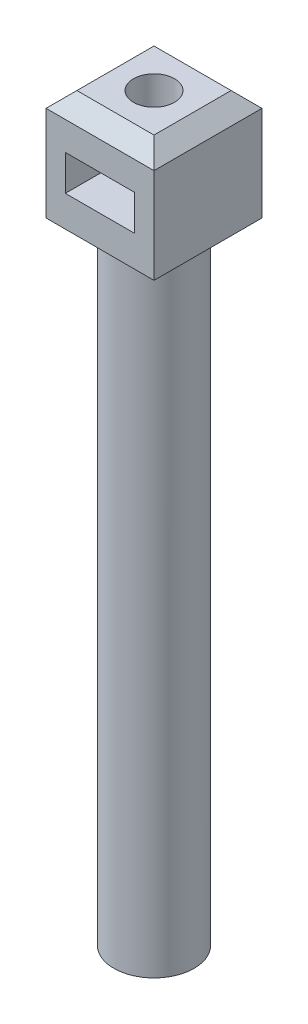
ISO-10303-21;
HEADER;
FILE_DESCRIPTION(('STEP AP214'),'2;1');
FILE_NAME('part.step','',(''),(''),'','','');
FILE_SCHEMA(('AUTOMOTIVE_DESIGN { 1 0 10303 214 1 1 1 1 }'));
ENDSEC;
DATA;
#1=APPLICATION_CONTEXT('core data for automotive mechanical design processes');
#2=APPLICATION_PROTOCOL_DEFINITION('international standard','automotive_design',2000,#1);
#3=PRODUCT_CONTEXT('',#1,'mechanical');
#4=PRODUCT('Part','Part','',(#3));
#5=PRODUCT_RELATED_PRODUCT_CATEGORY('part','',(#4));
#6=PRODUCT_DEFINITION_FORMATION('','',#4);
#7=PRODUCT_DEFINITION_CONTEXT('part definition',#1,'design');
#8=PRODUCT_DEFINITION('design','',#6,#7);
#9=PRODUCT_DEFINITION_SHAPE('','',#8);
#10=(LENGTH_UNIT() NAMED_UNIT(*) SI_UNIT(.MILLI.,.METRE.));
#11=(NAMED_UNIT(*) PLANE_ANGLE_UNIT() SI_UNIT($,.RADIAN.));
#12=(NAMED_UNIT(*) SI_UNIT($,.STERADIAN.) SOLID_ANGLE_UNIT());
#13=UNCERTAINTY_MEASURE_WITH_UNIT(LENGTH_MEASURE(1.E-05),#10,'distance_accuracy_value','');
#14=(GEOMETRIC_REPRESENTATION_CONTEXT(3) GLOBAL_UNCERTAINTY_ASSIGNED_CONTEXT((#13)) GLOBAL_UNIT_ASSIGNED_CONTEXT((#10,
#11,#12)) REPRESENTATION_CONTEXT('',''));
#15=CARTESIAN_POINT('',(0.,0.,0.));
#16=DIRECTION('',(0.,0.,1.));
#17=DIRECTION('',(1.,0.,0.));
#18=AXIS2_PLACEMENT_3D('',#15,#16,#17);
#19=CARTESIAN_POINT('',(0.,50.8,0.));
#20=DIRECTION('',(0.,-1.,0.));
#21=DIRECTION('',(0.,0.,-1.));
#22=AXIS2_PLACEMENT_3D('',#19,#20,#21);
#23=PLANE('',#22);
#24=DIRECTION('',(0.,0.,-1.));
#25=VECTOR('',#24,1.);
#26=CARTESIAN_POINT('',(-6.34999999999998,50.8,-8.89));
#27=LINE('',#26,#25);
#28=CARTESIAN_POINT('',(-6.34999999999998,50.8,-1.81392282084995));
#29=VERTEX_POINT('',#28);
#30=CARTESIAN_POINT('',(-6.34999999999998,50.8,-6.34999999999998));
#31=VERTEX_POINT('',#30);
#32=EDGE_CURVE('E194',#29,#31,#27,.T.);
#33=ORIENTED_EDGE('',*,*,#32,.T.);
#34=DIRECTION('',(1.,0.,0.));
#35=VECTOR('',#34,1.);
#36=CARTESIAN_POINT('',(8.89,50.8,-6.34999999999998));
#37=LINE('',#36,#35);
#38=CARTESIAN_POINT('',(-1.81392282084994,50.8,-6.34999999999998));
#39=VERTEX_POINT('',#38);
#40=EDGE_CURVE('E196',#31,#39,#37,.T.);
#41=ORIENTED_EDGE('',*,*,#40,.T.);
#42=CARTESIAN_POINT('',(0.,50.8,0.));
#43=DIRECTION('',(0.,-1.,0.));
#44=DIRECTION('',(0.,0.,-1.));
#45=AXIS2_PLACEMENT_3D('',#42,#43,#44);
#46=CIRCLE('',#45,6.604);
#47=EDGE_CURVE('E287',#29,#39,#46,.T.);
#48=ORIENTED_EDGE('',*,*,#47,.F.);
#49=EDGE_LOOP('',(#33,#41,#48));
#50=FACE_BOUND('',#49,.T.);
#51=ADVANCED_FACE('F35',(#50),#23,.T.);
#52=CARTESIAN_POINT('',(1.81392282084994,50.8,-6.34999999999998));
#53=VERTEX_POINT('',#52);
#54=CARTESIAN_POINT('',(6.34999999999999,50.8,-1.81392282084993));
#55=VERTEX_POINT('',#54);
#56=EDGE_CURVE('E159',#53,#55,#46,.T.);
#57=ORIENTED_EDGE('',*,*,#56,.F.);
#58=DIRECTION('',(1.,0.,0.));
#59=VECTOR('',#58,1.);
#60=CARTESIAN_POINT('',(8.89,50.8,-6.34999999999998));
#61=LINE('',#60,#59);
#62=CARTESIAN_POINT('',(6.34999999999999,50.8,-6.34999999999998));
#63=VERTEX_POINT('',#62);
#64=EDGE_CURVE('E192',#53,#63,#61,.T.);
#65=ORIENTED_EDGE('',*,*,#64,.T.);
#66=DIRECTION('',(0.,0.,1.));
#67=VECTOR('',#66,1.);
#68=CARTESIAN_POINT('',(6.34999999999999,50.8,8.89));
#69=LINE('',#68,#67);
#70=EDGE_CURVE('E190',#63,#55,#69,.T.);
#71=ORIENTED_EDGE('',*,*,#70,.T.);
#72=EDGE_LOOP('',(#57,#65,#71));
#73=FACE_BOUND('',#72,.T.);
#74=ADVANCED_FACE('F318',(#73),#23,.T.);
#75=CARTESIAN_POINT('',(6.34999999999999,50.8,1.81392282084993));
#76=VERTEX_POINT('',#75);
#77=CARTESIAN_POINT('',(1.81392282084994,50.8,6.34999999999998));
#78=VERTEX_POINT('',#77);
#79=EDGE_CURVE('E289',#76,#78,#46,.T.);
#80=ORIENTED_EDGE('',*,*,#79,.F.);
#81=DIRECTION('',(0.,0.,1.));
#82=VECTOR('',#81,1.);
#83=CARTESIAN_POINT('',(6.34999999999999,50.8,8.89));
#84=LINE('',#83,#82);
#85=CARTESIAN_POINT('',(6.34999999999999,50.8,6.34999999999998));
#86=VERTEX_POINT('',#85);
#87=EDGE_CURVE('E188',#76,#86,#84,.T.);
#88=ORIENTED_EDGE('',*,*,#87,.T.);
#89=DIRECTION('',(-1.,0.,0.));
#90=VECTOR('',#89,1.);
#91=CARTESIAN_POINT('',(-8.89,50.8,6.34999999999998));
#92=LINE('',#91,#90);
#93=EDGE_CURVE('E186',#86,#78,#92,.T.);
#94=ORIENTED_EDGE('',*,*,#93,.T.);
#95=EDGE_LOOP('',(#80,#88,#94));
#96=FACE_BOUND('',#95,.T.);
#97=ADVANCED_FACE('F339',(#96),#23,.T.);
#98=CARTESIAN_POINT('',(0.,63.5,0.));
#99=DIRECTION('',(0.,-1.,0.));
#100=DIRECTION('',(0.,0.,-1.));
#101=AXIS2_PLACEMENT_3D('',#98,#99,#100);
#102=CYLINDRICAL_SURFACE('',#101,6.604);
#103=ORIENTED_EDGE('',*,*,#56,.T.);
#104=CARTESIAN_POINT('',(0.,45.4717173420242,0.));
#105=DIRECTION('',(0.642787609686544,-0.766044443118974,0.));
#106=DIRECTION('',(-0.766044443118974,-0.642787609686544,0.));
#107=AXIS2_PLACEMENT_3D('',#104,#105,#106);
#108=ELLIPSE('',#107,8.62090973875041,6.604);
#109=EDGE_CURVE('E212',#55,#76,#108,.T.);
#110=ORIENTED_EDGE('',*,*,#109,.T.);
#111=ORIENTED_EDGE('',*,*,#79,.T.);
#112=CARTESIAN_POINT('',(0.,45.4717173420242,0.));
#113=DIRECTION('',(0.,-0.766044443118974,0.642787609686544));
#114=DIRECTION('',(0.,-0.642787609686544,-0.766044443118974));
#115=AXIS2_PLACEMENT_3D('',#112,#113,#114);
#116=ELLIPSE('',#115,8.62090973875041,6.604);
#117=CARTESIAN_POINT('',(-1.81392282084994,50.8,6.34999999999998));
#118=VERTEX_POINT('',#117);
#119=EDGE_CURVE('E214',#78,#118,#116,.T.);
#120=ORIENTED_EDGE('',*,*,#119,.T.);
#121=CARTESIAN_POINT('',(-6.34999999999998,50.8,1.81392282084995));
#122=VERTEX_POINT('',#121);
#123=EDGE_CURVE('E294',#118,#122,#46,.T.);
#124=ORIENTED_EDGE('',*,*,#123,.T.);
#125=CARTESIAN_POINT('',(0.,45.4717173420242,0.));
#126=DIRECTION('',(-0.642787609686544,-0.766044443118974,0.));
#127=DIRECTION('',(0.766044443118974,-0.642787609686544,0.));
#128=AXIS2_PLACEMENT_3D('',#125,#126,#127);
#129=ELLIPSE('',#128,8.62090973875041,6.604);
#130=EDGE_CURVE('E210',#122,#29,#129,.T.);
#131=ORIENTED_EDGE('',*,*,#130,.T.);
#132=ORIENTED_EDGE('',*,*,#47,.T.);
#133=CARTESIAN_POINT('',(0.,45.4717173420242,0.));
#134=DIRECTION('',(0.,-0.766044443118974,-0.642787609686544));
#135=DIRECTION('',(0.,-0.642787609686544,0.766044443118974));
#136=AXIS2_PLACEMENT_3D('',#133,#134,#135);
#137=ELLIPSE('',#136,8.62090973875041,6.604);
#138=EDGE_CURVE('E208',#39,#53,#137,.T.);
#139=ORIENTED_EDGE('',*,*,#138,.T.);
#140=EDGE_LOOP('',(#103,#110,#111,#120,#124,#131,#132,#139));
#141=FACE_BOUND('',#140,.T.);
#142=CARTESIAN_POINT('',(0.,-50.8,0.));
#143=DIRECTION('',(0.,-1.,0.));
#144=DIRECTION('',(0.,0.,-1.));
#145=AXIS2_PLACEMENT_3D('',#142,#143,#144);
#146=CIRCLE('',#145,6.604);
#147=CARTESIAN_POINT('',(0.,-50.8,-6.604));
#148=VERTEX_POINT('',#147);
#149=EDGE_CURVE('E249',#148,#148,#146,.T.);
#150=ORIENTED_EDGE('',*,*,#149,.F.);
#151=EDGE_LOOP('',(#150));
#152=FACE_BOUND('',#151,.T.);
#153=ADVANCED_FACE('F300',(#141,#152),#102,.T.);
#154=DIRECTION('',(-1.,0.,0.));
#155=VECTOR('',#154,1.);
#156=CARTESIAN_POINT('',(-8.89,50.8,6.34999999999998));
#157=LINE('',#156,#155);
#158=CARTESIAN_POINT('',(-6.34999999999998,50.8,6.34999999999998));
#159=VERTEX_POINT('',#158);
#160=EDGE_CURVE('E182',#118,#159,#157,.T.);
#161=ORIENTED_EDGE('',*,*,#160,.T.);
#162=DIRECTION('',(0.,0.,-1.));
#163=VECTOR('',#162,1.);
#164=CARTESIAN_POINT('',(-6.34999999999998,50.8,-8.89));
#165=LINE('',#164,#163);
#166=EDGE_CURVE('E184',#159,#122,#165,.T.);
#167=ORIENTED_EDGE('',*,*,#166,.T.);
#168=ORIENTED_EDGE('',*,*,#123,.F.);
#169=EDGE_LOOP('',(#161,#167,#168));
#170=FACE_BOUND('',#169,.T.);
#171=ADVANCED_FACE('F342',(#170),#23,.T.);
#172=CARTESIAN_POINT('',(8.89,71.12,8.89));
#173=DIRECTION('',(-1.,0.,0.));
#174=DIRECTION('',(0.,0.,1.));
#175=AXIS2_PLACEMENT_3D('',#172,#173,#174);
#176=PLANE('',#175);
#177=DIRECTION('',(0.,-1.,0.));
#178=VECTOR('',#177,1.);
#179=CARTESIAN_POINT('',(8.89,71.12,-8.89));
#180=LINE('',#179,#178);
#181=CARTESIAN_POINT('',(8.89,68.58,-8.89));
#182=VERTEX_POINT('',#181);
#183=CARTESIAN_POINT('',(8.89,52.9313130631903,-8.89));
#184=VERTEX_POINT('',#183);
#185=EDGE_CURVE('E286',#182,#184,#180,.T.);
#186=ORIENTED_EDGE('',*,*,#185,.F.);
#187=DIRECTION('',(0.,0.,1.));
#188=VECTOR('',#187,1.);
#189=CARTESIAN_POINT('',(8.89,68.58,8.89));
#190=LINE('',#189,#188);
#191=CARTESIAN_POINT('',(8.89,68.58,8.89));
#192=VERTEX_POINT('',#191);
#193=EDGE_CURVE('E232',#182,#192,#190,.T.);
#194=ORIENTED_EDGE('',*,*,#193,.T.);
#195=DIRECTION('',(0.,-1.,0.));
#196=VECTOR('',#195,1.);
#197=CARTESIAN_POINT('',(8.89,71.12,8.89));
#198=LINE('',#197,#196);
#199=CARTESIAN_POINT('',(8.89,52.9313130631903,8.89));
#200=VERTEX_POINT('',#199);
#201=EDGE_CURVE('E280',#192,#200,#198,.T.);
#202=ORIENTED_EDGE('',*,*,#201,.T.);
#203=DIRECTION('',(0.,0.,-1.));
#204=VECTOR('',#203,1.);
#205=CARTESIAN_POINT('',(8.89,52.9313130631903,-8.89));
#206=LINE('',#205,#204);
#207=EDGE_CURVE('E202',#200,#184,#206,.T.);
#208=ORIENTED_EDGE('',*,*,#207,.T.);
#209=EDGE_LOOP('',(#186,#194,#202,#208));
#210=FACE_BOUND('',#209,.T.);
#211=ADVANCED_FACE('F330',(#210),#176,.F.);
#212=CARTESIAN_POINT('',(-8.89,71.12,-8.89));
#213=DIRECTION('',(0.,0.,1.));
#214=DIRECTION('',(1.,0.,0.));
#215=AXIS2_PLACEMENT_3D('',#212,#213,#214);
#216=PLANE('',#215);
#217=DIRECTION('',(1.,0.,0.));
#218=VECTOR('',#217,1.);
#219=CARTESIAN_POINT('',(-8.89,58.039,-8.89));
#220=LINE('',#219,#218);
#221=CARTESIAN_POINT('',(-5.71500000000003,58.039,-8.89));
#222=VERTEX_POINT('',#221);
#223=CARTESIAN_POINT('',(5.71499999999997,58.039,-8.89));
#224=VERTEX_POINT('',#223);
#225=EDGE_CURVE('E274',#222,#224,#220,.T.);
#226=ORIENTED_EDGE('',*,*,#225,.T.);
#227=DIRECTION('',(0.,1.,0.));
#228=VECTOR('',#227,1.);
#229=CARTESIAN_POINT('',(5.71499999999997,71.12,-8.89));
#230=LINE('',#229,#228);
#231=CARTESIAN_POINT('',(5.71499999999997,63.881,-8.89));
#232=VERTEX_POINT('',#231);
#233=EDGE_CURVE('E277',#224,#232,#230,.T.);
#234=ORIENTED_EDGE('',*,*,#233,.T.);
#235=DIRECTION('',(-1.,0.,0.));
#236=VECTOR('',#235,1.);
#237=CARTESIAN_POINT('',(-8.89,63.881,-8.89));
#238=LINE('',#237,#236);
#239=CARTESIAN_POINT('',(-5.71500000000003,63.881,-8.89));
#240=VERTEX_POINT('',#239);
#241=EDGE_CURVE('E269',#232,#240,#238,.T.);
#242=ORIENTED_EDGE('',*,*,#241,.T.);
#243=DIRECTION('',(0.,-1.,0.));
#244=VECTOR('',#243,1.);
#245=CARTESIAN_POINT('',(-5.71500000000003,71.12,-8.89));
#246=LINE('',#245,#244);
#247=EDGE_CURVE('E166',#240,#222,#246,.T.);
#248=ORIENTED_EDGE('',*,*,#247,.T.);
#249=EDGE_LOOP('',(#226,#234,#242,#248));
#250=FACE_BOUND('',#249,.T.);
#251=DIRECTION('',(0.,-1.,0.));
#252=VECTOR('',#251,1.);
#253=CARTESIAN_POINT('',(-8.89,71.12,-8.89));
#254=LINE('',#253,#252);
#255=CARTESIAN_POINT('',(-8.89,68.58,-8.89));
#256=VERTEX_POINT('',#255);
#257=CARTESIAN_POINT('',(-8.89,52.9313130631903,-8.89));
#258=VERTEX_POINT('',#257);
#259=EDGE_CURVE('E284',#256,#258,#254,.T.);
#260=ORIENTED_EDGE('',*,*,#259,.F.);
#261=DIRECTION('',(1.,0.,0.));
#262=VECTOR('',#261,1.);
#263=CARTESIAN_POINT('',(-8.89,68.58,-8.89));
#264=LINE('',#263,#262);
#265=EDGE_CURVE('E242',#256,#182,#264,.T.);
#266=ORIENTED_EDGE('',*,*,#265,.T.);
#267=ORIENTED_EDGE('',*,*,#185,.T.);
#268=DIRECTION('',(-1.,0.,0.));
#269=VECTOR('',#268,1.);
#270=CARTESIAN_POINT('',(-8.89,52.9313130631903,-8.89));
#271=LINE('',#270,#269);
#272=EDGE_CURVE('E179',#184,#258,#271,.T.);
#273=ORIENTED_EDGE('',*,*,#272,.T.);
#274=EDGE_LOOP('',(#260,#266,#267,#273));
#275=FACE_BOUND('',#274,.T.);
#276=ADVANCED_FACE('F326',(#250,#275),#216,.F.);
#277=CARTESIAN_POINT('',(-8.89,71.12,8.89));
#278=DIRECTION('',(1.,0.,0.));
#279=DIRECTION('',(0.,0.,-1.));
#280=AXIS2_PLACEMENT_3D('',#277,#278,#279);
#281=PLANE('',#280);
#282=DIRECTION('',(0.,-1.,0.));
#283=VECTOR('',#282,1.);
#284=CARTESIAN_POINT('',(-8.89,71.12,8.89));
#285=LINE('',#284,#283);
#286=CARTESIAN_POINT('',(-8.89,68.58,8.89));
#287=VERTEX_POINT('',#286);
#288=CARTESIAN_POINT('',(-8.89,52.9313130631903,8.89));
#289=VERTEX_POINT('',#288);
#290=EDGE_CURVE('E282',#287,#289,#285,.T.);
#291=ORIENTED_EDGE('',*,*,#290,.F.);
#292=DIRECTION('',(0.,0.,-1.));
#293=VECTOR('',#292,1.);
#294=CARTESIAN_POINT('',(-8.89,68.58,8.89));
#295=LINE('',#294,#293);
#296=EDGE_CURVE('E44',#287,#256,#295,.T.);
#297=ORIENTED_EDGE('',*,*,#296,.T.);
#298=ORIENTED_EDGE('',*,*,#259,.T.);
#299=DIRECTION('',(0.,0.,1.));
#300=VECTOR('',#299,1.);
#301=CARTESIAN_POINT('',(-8.89,52.9313130631903,8.89));
#302=LINE('',#301,#300);
#303=EDGE_CURVE('E199',#258,#289,#302,.T.);
#304=ORIENTED_EDGE('',*,*,#303,.T.);
#305=EDGE_LOOP('',(#291,#297,#298,#304));
#306=FACE_BOUND('',#305,.T.);
#307=ADVANCED_FACE('F443',(#306),#281,.F.);
#308=CARTESIAN_POINT('',(-8.89,71.12,8.89));
#309=DIRECTION('',(0.,0.,-1.));
#310=DIRECTION('',(-1.,0.,0.));
#311=AXIS2_PLACEMENT_3D('',#308,#309,#310);
#312=PLANE('',#311);
#313=DIRECTION('',(1.,0.,0.));
#314=VECTOR('',#313,1.);
#315=CARTESIAN_POINT('',(-8.89,63.881,8.89));
#316=LINE('',#315,#314);
#317=CARTESIAN_POINT('',(-5.71500000000003,63.881,8.89));
#318=VERTEX_POINT('',#317);
#319=CARTESIAN_POINT('',(5.71499999999997,63.881,8.89));
#320=VERTEX_POINT('',#319);
#321=EDGE_CURVE('E147',#318,#320,#316,.T.);
#322=ORIENTED_EDGE('',*,*,#321,.T.);
#323=DIRECTION('',(0.,-1.,0.));
#324=VECTOR('',#323,1.);
#325=CARTESIAN_POINT('',(5.71499999999997,71.12,8.89));
#326=LINE('',#325,#324);
#327=CARTESIAN_POINT('',(5.71499999999997,58.039,8.89));
#328=VERTEX_POINT('',#327);
#329=EDGE_CURVE('E174',#320,#328,#326,.T.);
#330=ORIENTED_EDGE('',*,*,#329,.T.);
#331=DIRECTION('',(-1.,0.,0.));
#332=VECTOR('',#331,1.);
#333=CARTESIAN_POINT('',(-8.89,58.039,8.89));
#334=LINE('',#333,#332);
#335=CARTESIAN_POINT('',(-5.71500000000003,58.039,8.89));
#336=VERTEX_POINT('',#335);
#337=EDGE_CURVE('E172',#328,#336,#334,.T.);
#338=ORIENTED_EDGE('',*,*,#337,.T.);
#339=DIRECTION('',(0.,1.,0.));
#340=VECTOR('',#339,1.);
#341=CARTESIAN_POINT('',(-5.71500000000003,71.12,8.89));
#342=LINE('',#341,#340);
#343=EDGE_CURVE('E158',#336,#318,#342,.T.);
#344=ORIENTED_EDGE('',*,*,#343,.T.);
#345=EDGE_LOOP('',(#322,#330,#338,#344));
#346=FACE_BOUND('',#345,.T.);
#347=ORIENTED_EDGE('',*,*,#201,.F.);
#348=DIRECTION('',(-1.,0.,0.));
#349=VECTOR('',#348,1.);
#350=CARTESIAN_POINT('',(-8.89,68.58,8.89));
#351=LINE('',#350,#349);
#352=EDGE_CURVE('E11',#192,#287,#351,.T.);
#353=ORIENTED_EDGE('',*,*,#352,.T.);
#354=ORIENTED_EDGE('',*,*,#290,.T.);
#355=DIRECTION('',(1.,0.,0.));
#356=VECTOR('',#355,1.);
#357=CARTESIAN_POINT('',(8.89,52.9313130631903,8.89));
#358=LINE('',#357,#356);
#359=EDGE_CURVE('E205',#289,#200,#358,.T.);
#360=ORIENTED_EDGE('',*,*,#359,.T.);
#361=EDGE_LOOP('',(#347,#353,#354,#360));
#362=FACE_BOUND('',#361,.T.);
#363=ADVANCED_FACE('F171',(#346,#362),#312,.F.);
#364=CARTESIAN_POINT('',(0.,71.12,0.));
#365=DIRECTION('',(0.,-1.,0.));
#366=DIRECTION('',(0.,0.,-1.));
#367=AXIS2_PLACEMENT_3D('',#364,#365,#366);
#368=PLANE('',#367);
#369=CARTESIAN_POINT('',(0.,71.12,0.));
#370=DIRECTION('',(0.,1.,0.));
#371=DIRECTION('',(0.,0.,1.));
#372=AXIS2_PLACEMENT_3D('',#369,#370,#371);
#373=CIRCLE('',#372,3.37819999999999);
#374=CARTESIAN_POINT('',(0.,71.12,3.37819999999999));
#375=VERTEX_POINT('',#374);
#376=EDGE_CURVE('E256',#375,#375,#373,.T.);
#377=ORIENTED_EDGE('',*,*,#376,.F.);
#378=EDGE_LOOP('',(#377));
#379=FACE_BOUND('',#378,.T.);
#380=DIRECTION('',(0.,0.,-1.));
#381=VECTOR('',#380,1.);
#382=CARTESIAN_POINT('',(6.35,71.12,0.));
#383=LINE('',#382,#381);
#384=CARTESIAN_POINT('',(6.35,71.12,6.35));
#385=VERTEX_POINT('',#384);
#386=CARTESIAN_POINT('',(6.35,71.12,-6.35));
#387=VERTEX_POINT('',#386);
#388=EDGE_CURVE('E216',#385,#387,#383,.T.);
#389=ORIENTED_EDGE('',*,*,#388,.T.);
#390=DIRECTION('',(-1.,0.,0.));
#391=VECTOR('',#390,1.);
#392=CARTESIAN_POINT('',(0.,71.12,-6.35));
#393=LINE('',#392,#391);
#394=CARTESIAN_POINT('',(-6.35,71.12,-6.35));
#395=VERTEX_POINT('',#394);
#396=EDGE_CURVE('E239',#387,#395,#393,.T.);
#397=ORIENTED_EDGE('',*,*,#396,.T.);
#398=DIRECTION('',(0.,0.,1.));
#399=VECTOR('',#398,1.);
#400=CARTESIAN_POINT('',(-6.35,71.12,0.));
#401=LINE('',#400,#399);
#402=CARTESIAN_POINT('',(-6.35,71.12,6.35));
#403=VERTEX_POINT('',#402);
#404=EDGE_CURVE('E237',#395,#403,#401,.T.);
#405=ORIENTED_EDGE('',*,*,#404,.T.);
#406=DIRECTION('',(1.,0.,0.));
#407=VECTOR('',#406,1.);
#408=CARTESIAN_POINT('',(0.,71.12,6.35));
#409=LINE('',#408,#407);
#410=EDGE_CURVE('E235',#403,#385,#409,.T.);
#411=ORIENTED_EDGE('',*,*,#410,.T.);
#412=EDGE_LOOP('',(#389,#397,#405,#411));
#413=FACE_BOUND('',#412,.T.);
#414=ADVANCED_FACE('F461',(#379,#413),#368,.F.);
#415=CARTESIAN_POINT('',(5.71499999999997,58.039,-12.7));
#416=DIRECTION('',(1.,0.,0.));
#417=DIRECTION('',(0.,0.,-1.));
#418=AXIS2_PLACEMENT_3D('',#415,#416,#417);
#419=PLANE('',#418);
#420=DIRECTION('',(0.,0.,1.));
#421=VECTOR('',#420,1.);
#422=CARTESIAN_POINT('',(5.71499999999997,58.039,-12.7));
#423=LINE('',#422,#421);
#424=EDGE_CURVE('E266',#224,#328,#423,.T.);
#425=ORIENTED_EDGE('',*,*,#424,.T.);
#426=ORIENTED_EDGE('',*,*,#329,.F.);
#427=DIRECTION('',(0.,0.,1.));
#428=VECTOR('',#427,1.);
#429=CARTESIAN_POINT('',(5.71499999999997,63.881,-12.7));
#430=LINE('',#429,#428);
#431=EDGE_CURVE('E153',#232,#320,#430,.T.);
#432=ORIENTED_EDGE('',*,*,#431,.F.);
#433=ORIENTED_EDGE('',*,*,#233,.F.);
#434=EDGE_LOOP('',(#425,#426,#432,#433));
#435=FACE_BOUND('',#434,.T.);
#436=ADVANCED_FACE('F469',(#435),#419,.F.);
#437=CARTESIAN_POINT('',(-5.71500000000003,58.039,-12.7));
#438=DIRECTION('',(0.,-1.,0.));
#439=DIRECTION('',(0.,0.,-1.));
#440=AXIS2_PLACEMENT_3D('',#437,#438,#439);
#441=PLANE('',#440);
#442=DIRECTION('',(0.,0.,1.));
#443=VECTOR('',#442,1.);
#444=CARTESIAN_POINT('',(-5.71500000000003,58.039,-12.7));
#445=LINE('',#444,#443);
#446=EDGE_CURVE('E168',#222,#336,#445,.T.);
#447=ORIENTED_EDGE('',*,*,#446,.T.);
#448=ORIENTED_EDGE('',*,*,#337,.F.);
#449=ORIENTED_EDGE('',*,*,#424,.F.);
#450=ORIENTED_EDGE('',*,*,#225,.F.);
#451=EDGE_LOOP('',(#447,#448,#449,#450));
#452=FACE_BOUND('',#451,.T.);
#453=ADVANCED_FACE('F524',(#452),#441,.F.);
#454=CARTESIAN_POINT('',(-5.71500000000003,58.039,-12.7));
#455=DIRECTION('',(-1.,0.,0.));
#456=DIRECTION('',(0.,0.,1.));
#457=AXIS2_PLACEMENT_3D('',#454,#455,#456);
#458=PLANE('',#457);
#459=DIRECTION('',(0.,0.,1.));
#460=VECTOR('',#459,1.);
#461=CARTESIAN_POINT('',(-5.71500000000003,63.881,-12.7));
#462=LINE('',#461,#460);
#463=EDGE_CURVE('E150',#240,#318,#462,.T.);
#464=ORIENTED_EDGE('',*,*,#463,.T.);
#465=ORIENTED_EDGE('',*,*,#343,.F.);
#466=ORIENTED_EDGE('',*,*,#446,.F.);
#467=ORIENTED_EDGE('',*,*,#247,.F.);
#468=EDGE_LOOP('',(#464,#465,#466,#467));
#469=FACE_BOUND('',#468,.T.);
#470=ADVANCED_FACE('F162',(#469),#458,.F.);
#471=CARTESIAN_POINT('',(-5.71500000000003,63.881,-12.7));
#472=DIRECTION('',(0.,1.,0.));
#473=DIRECTION('',(0.,0.,1.));
#474=AXIS2_PLACEMENT_3D('',#471,#472,#473);
#475=PLANE('',#474);
#476=CARTESIAN_POINT('',(0.,63.881,0.));
#477=DIRECTION('',(0.,1.,0.));
#478=DIRECTION('',(0.,0.,1.));
#479=AXIS2_PLACEMENT_3D('',#476,#477,#478);
#480=CIRCLE('',#479,3.3782);
#481=CARTESIAN_POINT('',(0.,63.881,3.3782));
#482=VERTEX_POINT('',#481);
#483=EDGE_CURVE('E221',#482,#482,#480,.T.);
#484=ORIENTED_EDGE('',*,*,#483,.T.);
#485=EDGE_LOOP('',(#484));
#486=FACE_BOUND('',#485,.T.);
#487=ORIENTED_EDGE('',*,*,#431,.T.);
#488=ORIENTED_EDGE('',*,*,#321,.F.);
#489=ORIENTED_EDGE('',*,*,#463,.F.);
#490=ORIENTED_EDGE('',*,*,#241,.F.);
#491=EDGE_LOOP('',(#487,#488,#489,#490));
#492=FACE_BOUND('',#491,.T.);
#493=ADVANCED_FACE('F149',(#486,#492),#475,.F.);
#494=CARTESIAN_POINT('',(-8.89,52.9313130631903,8.89));
#495=DIRECTION('',(0.,-0.766044443118974,0.642787609686544));
#496=DIRECTION('',(-1.,0.,0.));
#497=AXIS2_PLACEMENT_3D('',#494,#495,#496);
#498=PLANE('',#497);
#499=ORIENTED_EDGE('',*,*,#119,.F.);
#500=ORIENTED_EDGE('',*,*,#93,.F.);
#501=DIRECTION('',(0.608120402411341,0.510273605374742,0.608120402411341));
#502=VECTOR('',#501,1.);
#503=CARTESIAN_POINT('',(2.31477066432161,47.4140405527165,2.3147706643216));
#504=LINE('',#503,#502);
#505=EDGE_CURVE('E227',#200,#86,#504,.F.);
#506=ORIENTED_EDGE('',*,*,#505,.F.);
#507=ORIENTED_EDGE('',*,*,#359,.F.);
#508=DIRECTION('',(0.608120402411341,-0.510273605374742,-0.608120402411341));
#509=VECTOR('',#508,1.);
#510=CARTESIAN_POINT('',(-8.89,52.9313130631903,8.89));
#511=LINE('',#510,#509);
#512=EDGE_CURVE('E224',#159,#289,#511,.F.);
#513=ORIENTED_EDGE('',*,*,#512,.F.);
#514=ORIENTED_EDGE('',*,*,#160,.F.);
#515=EDGE_LOOP('',(#499,#500,#506,#507,#513,#514));
#516=FACE_BOUND('',#515,.T.);
#517=ADVANCED_FACE('F335',(#516),#498,.T.);
#518=CARTESIAN_POINT('',(8.89,52.9313130631903,8.89));
#519=DIRECTION('',(0.642787609686544,-0.766044443118974,0.));
#520=DIRECTION('',(0.,0.,1.));
#521=AXIS2_PLACEMENT_3D('',#518,#519,#520);
#522=PLANE('',#521);
#523=ORIENTED_EDGE('',*,*,#109,.F.);
#524=ORIENTED_EDGE('',*,*,#70,.F.);
#525=DIRECTION('',(0.608120402411341,0.510273605374742,-0.608120402411341));
#526=VECTOR('',#525,1.);
#527=CARTESIAN_POINT('',(2.3147706643216,47.4140405527165,-2.3147706643216));
#528=LINE('',#527,#526);
#529=EDGE_CURVE('E220',#184,#63,#528,.F.);
#530=ORIENTED_EDGE('',*,*,#529,.F.);
#531=ORIENTED_EDGE('',*,*,#207,.F.);
#532=ORIENTED_EDGE('',*,*,#505,.T.);
#533=ORIENTED_EDGE('',*,*,#87,.F.);
#534=EDGE_LOOP('',(#523,#524,#530,#531,#532,#533));
#535=FACE_BOUND('',#534,.T.);
#536=ADVANCED_FACE('F322',(#535),#522,.T.);
#537=CARTESIAN_POINT('',(-8.89,52.9313130631903,8.89));
#538=DIRECTION('',(-0.642787609686544,-0.766044443118974,0.));
#539=DIRECTION('',(0.,0.,-1.));
#540=AXIS2_PLACEMENT_3D('',#537,#538,#539);
#541=PLANE('',#540);
#542=ORIENTED_EDGE('',*,*,#512,.T.);
#543=ORIENTED_EDGE('',*,*,#303,.F.);
#544=DIRECTION('',(0.608120402411341,-0.510273605374742,0.608120402411341));
#545=VECTOR('',#544,1.);
#546=CARTESIAN_POINT('',(-2.3147706643216,47.4140405527165,-2.3147706643216));
#547=LINE('',#546,#545);
#548=EDGE_CURVE('E217',#31,#258,#547,.F.);
#549=ORIENTED_EDGE('',*,*,#548,.F.);
#550=ORIENTED_EDGE('',*,*,#32,.F.);
#551=ORIENTED_EDGE('',*,*,#130,.F.);
#552=ORIENTED_EDGE('',*,*,#166,.F.);
#553=EDGE_LOOP('',(#542,#543,#549,#550,#551,#552));
#554=FACE_BOUND('',#553,.T.);
#555=ADVANCED_FACE('F308',(#554),#541,.T.);
#556=CARTESIAN_POINT('',(-8.89,52.9313130631903,-8.89));
#557=DIRECTION('',(0.,-0.766044443118974,-0.642787609686544));
#558=DIRECTION('',(1.,0.,0.));
#559=AXIS2_PLACEMENT_3D('',#556,#557,#558);
#560=PLANE('',#559);
#561=ORIENTED_EDGE('',*,*,#138,.F.);
#562=ORIENTED_EDGE('',*,*,#40,.F.);
#563=ORIENTED_EDGE('',*,*,#548,.T.);
#564=ORIENTED_EDGE('',*,*,#272,.F.);
#565=ORIENTED_EDGE('',*,*,#529,.T.);
#566=ORIENTED_EDGE('',*,*,#64,.F.);
#567=EDGE_LOOP('',(#561,#562,#563,#564,#565,#566));
#568=FACE_BOUND('',#567,.T.);
#569=ADVANCED_FACE('F314',(#568),#560,.T.);
#570=CARTESIAN_POINT('',(0.,71.12,0.));
#571=DIRECTION('',(0.,1.,0.));
#572=DIRECTION('',(0.,0.,1.));
#573=AXIS2_PLACEMENT_3D('',#570,#571,#572);
#574=CYLINDRICAL_SURFACE('',#573,3.3782);
#575=ORIENTED_EDGE('',*,*,#483,.F.);
#576=EDGE_LOOP('',(#575));
#577=FACE_BOUND('',#576,.T.);
#578=ORIENTED_EDGE('',*,*,#376,.T.);
#579=EDGE_LOOP('',(#578));
#580=FACE_BOUND('',#579,.T.);
#581=ADVANCED_FACE('F407',(#577,#580),#574,.F.);
#582=CARTESIAN_POINT('',(6.35,71.12,0.));
#583=DIRECTION('',(-0.70710678118655,-0.707106781186546,0.));
#584=DIRECTION('',(0.,0.,-1.));
#585=AXIS2_PLACEMENT_3D('',#582,#583,#584);
#586=PLANE('',#585);
#587=ORIENTED_EDGE('',*,*,#193,.F.);
#588=DIRECTION('',(-0.577350269189625,0.577350269189628,0.577350269189625));
#589=VECTOR('',#588,1.);
#590=CARTESIAN_POINT('',(4.23333333333334,73.2366666666667,-4.23333333333334));
#591=LINE('',#590,#589);
#592=EDGE_CURVE('E246',#182,#387,#591,.T.);
#593=ORIENTED_EDGE('',*,*,#592,.T.);
#594=ORIENTED_EDGE('',*,*,#388,.F.);
#595=DIRECTION('',(0.577350269189625,-0.577350269189628,0.577350269189625));
#596=VECTOR('',#595,1.);
#597=CARTESIAN_POINT('',(4.23333333333334,73.2366666666667,4.23333333333334));
#598=LINE('',#597,#596);
#599=EDGE_CURVE('E244',#385,#192,#598,.T.);
#600=ORIENTED_EDGE('',*,*,#599,.T.);
#601=EDGE_LOOP('',(#587,#593,#594,#600));
#602=FACE_BOUND('',#601,.T.);
#603=ADVANCED_FACE('F425',(#602),#586,.F.);
#604=CARTESIAN_POINT('',(0.,71.12,6.35));
#605=DIRECTION('',(0.,-0.707106781186546,-0.70710678118655));
#606=DIRECTION('',(1.,0.,0.));
#607=AXIS2_PLACEMENT_3D('',#604,#605,#606);
#608=PLANE('',#607);
#609=ORIENTED_EDGE('',*,*,#599,.F.);
#610=ORIENTED_EDGE('',*,*,#410,.F.);
#611=DIRECTION('',(-0.577350269189625,-0.577350269189628,0.577350269189625));
#612=VECTOR('',#611,1.);
#613=CARTESIAN_POINT('',(-4.23333333333334,73.2366666666667,4.23333333333334));
#614=LINE('',#613,#612);
#615=EDGE_CURVE('E39',#287,#403,#614,.F.);
#616=ORIENTED_EDGE('',*,*,#615,.F.);
#617=ORIENTED_EDGE('',*,*,#352,.F.);
#618=EDGE_LOOP('',(#609,#610,#616,#617));
#619=FACE_BOUND('',#618,.T.);
#620=ADVANCED_FACE('F37',(#619),#608,.F.);
#621=CARTESIAN_POINT('',(-6.35,71.12,0.));
#622=DIRECTION('',(0.70710678118655,-0.707106781186546,0.));
#623=DIRECTION('',(0.,0.,1.));
#624=AXIS2_PLACEMENT_3D('',#621,#622,#623);
#625=PLANE('',#624);
#626=ORIENTED_EDGE('',*,*,#615,.T.);
#627=ORIENTED_EDGE('',*,*,#404,.F.);
#628=DIRECTION('',(-0.577350269189625,-0.577350269189628,-0.577350269189625));
#629=VECTOR('',#628,1.);
#630=CARTESIAN_POINT('',(-4.23333333333334,73.2366666666667,-4.23333333333334));
#631=LINE('',#630,#629);
#632=EDGE_CURVE('E248',#256,#395,#631,.F.);
#633=ORIENTED_EDGE('',*,*,#632,.F.);
#634=ORIENTED_EDGE('',*,*,#296,.F.);
#635=EDGE_LOOP('',(#626,#627,#633,#634));
#636=FACE_BOUND('',#635,.T.);
#637=ADVANCED_FACE('F487',(#636),#625,.F.);
#638=CARTESIAN_POINT('',(0.,71.12,-6.35));
#639=DIRECTION('',(0.,-0.707106781186546,0.70710678118655));
#640=DIRECTION('',(-1.,0.,0.));
#641=AXIS2_PLACEMENT_3D('',#638,#639,#640);
#642=PLANE('',#641);
#643=ORIENTED_EDGE('',*,*,#592,.F.);
#644=ORIENTED_EDGE('',*,*,#265,.F.);
#645=ORIENTED_EDGE('',*,*,#632,.T.);
#646=ORIENTED_EDGE('',*,*,#396,.F.);
#647=EDGE_LOOP('',(#643,#644,#645,#646));
#648=FACE_BOUND('',#647,.T.);
#649=ADVANCED_FACE('F496',(#648),#642,.F.);
#650=CARTESIAN_POINT('',(0.,-50.8,0.));
#651=DIRECTION('',(0.,-1.,0.));
#652=DIRECTION('',(0.,0.,-1.));
#653=AXIS2_PLACEMENT_3D('',#650,#651,#652);
#654=PLANE('',#653);
#655=ORIENTED_EDGE('',*,*,#149,.T.);
#656=EDGE_LOOP('',(#655));
#657=FACE_BOUND('',#656,.T.);
#658=ADVANCED_FACE('F505',(#657),#654,.T.);
#659=CLOSED_SHELL('',(#51,#74,#97,#153,#171,#211,#276,#307,#363,#414,#436,#453,#470,#493,#517,
#536,#555,#569,#581,#603,#620,#637,#649,#658));
#660=MANIFOLD_SOLID_BREP('B2',#659);
#661=ADVANCED_BREP_SHAPE_REPRESENTATION('',(#18,#660),#14);
#662=SHAPE_DEFINITION_REPRESENTATION(#9,#661);
ENDSEC;
END-ISO-10303-21;
